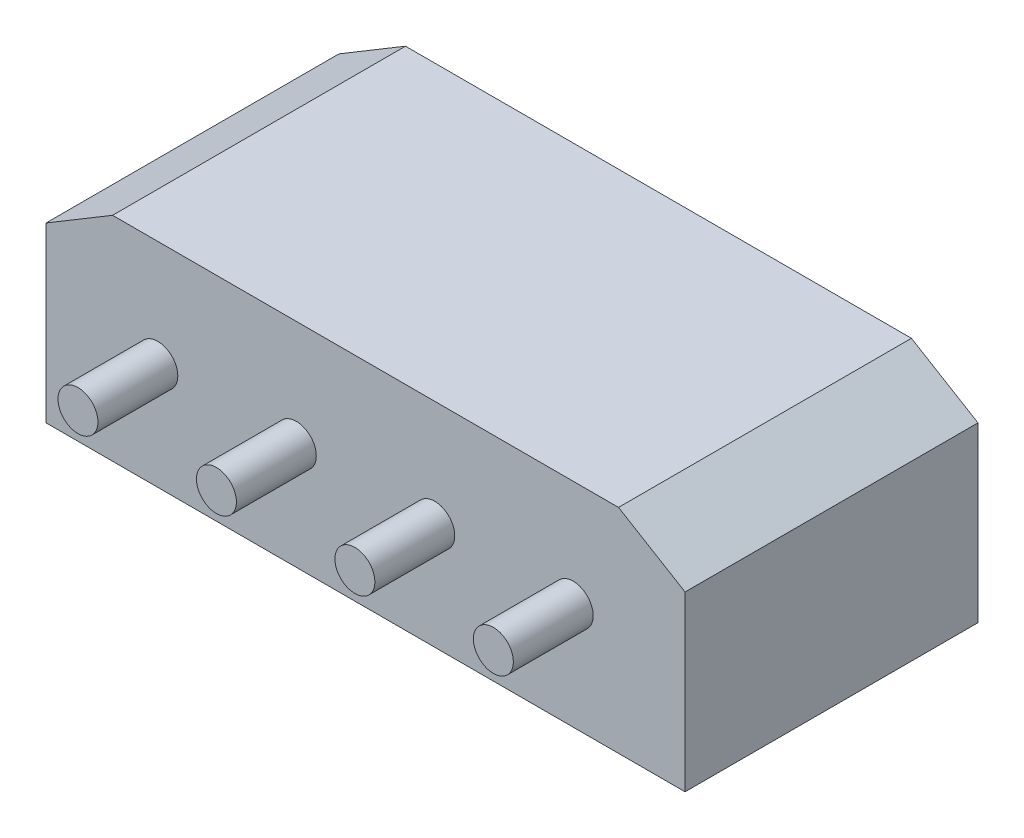
ISO-10303-21;
HEADER;
FILE_DESCRIPTION(('STEP AP214'),'2;1');
FILE_NAME('part.step','',(''),(''),'','','');
FILE_SCHEMA(('AUTOMOTIVE_DESIGN { 1 0 10303 214 1 1 1 1 }'));
ENDSEC;
DATA;
#1=APPLICATION_CONTEXT('core data for automotive mechanical design processes');
#2=APPLICATION_PROTOCOL_DEFINITION('international standard','automotive_design',2000,#1);
#3=PRODUCT_CONTEXT('',#1,'mechanical');
#4=PRODUCT('Part','Part','',(#3));
#5=PRODUCT_RELATED_PRODUCT_CATEGORY('part','',(#4));
#6=PRODUCT_DEFINITION_FORMATION('','',#4);
#7=PRODUCT_DEFINITION_CONTEXT('part definition',#1,'design');
#8=PRODUCT_DEFINITION('design','',#6,#7);
#9=PRODUCT_DEFINITION_SHAPE('','',#8);
#10=(LENGTH_UNIT() NAMED_UNIT(*) SI_UNIT(.MILLI.,.METRE.));
#11=(NAMED_UNIT(*) PLANE_ANGLE_UNIT() SI_UNIT($,.RADIAN.));
#12=(NAMED_UNIT(*) SI_UNIT($,.STERADIAN.) SOLID_ANGLE_UNIT());
#13=UNCERTAINTY_MEASURE_WITH_UNIT(LENGTH_MEASURE(1.E-05),#10,'distance_accuracy_value','');
#14=(GEOMETRIC_REPRESENTATION_CONTEXT(3) GLOBAL_UNCERTAINTY_ASSIGNED_CONTEXT((#13)) GLOBAL_UNIT_ASSIGNED_CONTEXT((#10,
#11,#12)) REPRESENTATION_CONTEXT('',''));
#15=CARTESIAN_POINT('',(0.,0.,0.));
#16=DIRECTION('',(0.,0.,1.));
#17=DIRECTION('',(1.,0.,0.));
#18=AXIS2_PLACEMENT_3D('',#15,#16,#17);
#19=CARTESIAN_POINT('',(-14.6,4.,0.));
#20=DIRECTION('',(0.,0.,1.));
#21=DIRECTION('',(1.,0.,0.));
#22=AXIS2_PLACEMENT_3D('',#19,#20,#21);
#23=CYLINDRICAL_SURFACE('',#22,0.75);
#24=CARTESIAN_POINT('',(-14.6,4.,11.));
#25=DIRECTION('',(0.,0.,1.));
#26=DIRECTION('',(1.,0.,0.));
#27=AXIS2_PLACEMENT_3D('',#24,#25,#26);
#28=CIRCLE('',#27,0.75);
#29=CARTESIAN_POINT('',(-13.85,4.,11.));
#30=VERTEX_POINT('',#29);
#31=EDGE_CURVE('E334',#30,#30,#28,.F.);
#32=ORIENTED_EDGE('',*,*,#31,.F.);
#33=EDGE_LOOP('',(#32));
#34=FACE_BOUND('',#33,.T.);
#35=CARTESIAN_POINT('',(-14.6,4.,14.));
#36=DIRECTION('',(0.,0.,1.));
#37=DIRECTION('',(1.,0.,0.));
#38=AXIS2_PLACEMENT_3D('',#35,#36,#37);
#39=CIRCLE('',#38,0.75);
#40=CARTESIAN_POINT('',(-13.85,4.,14.));
#41=VERTEX_POINT('',#40);
#42=EDGE_CURVE('E39',#41,#41,#39,.T.);
#43=ORIENTED_EDGE('',*,*,#42,.F.);
#44=EDGE_LOOP('',(#43));
#45=FACE_BOUND('',#44,.T.);
#46=ADVANCED_FACE('F35',(#34,#45),#23,.T.);
#47=CARTESIAN_POINT('',(-19.8,4.,0.));
#48=DIRECTION('',(0.,0.,1.));
#49=DIRECTION('',(1.,0.,0.));
#50=AXIS2_PLACEMENT_3D('',#47,#48,#49);
#51=CYLINDRICAL_SURFACE('',#50,0.75);
#52=CARTESIAN_POINT('',(-19.8,4.,11.));
#53=DIRECTION('',(0.,0.,1.));
#54=DIRECTION('',(1.,0.,0.));
#55=AXIS2_PLACEMENT_3D('',#52,#53,#54);
#56=CIRCLE('',#55,0.75);
#57=CARTESIAN_POINT('',(-19.05,4.,11.));
#58=VERTEX_POINT('',#57);
#59=EDGE_CURVE('E338',#58,#58,#56,.F.);
#60=ORIENTED_EDGE('',*,*,#59,.F.);
#61=EDGE_LOOP('',(#60));
#62=FACE_BOUND('',#61,.T.);
#63=CARTESIAN_POINT('',(-19.8,4.,14.));
#64=DIRECTION('',(0.,0.,1.));
#65=DIRECTION('',(1.,0.,0.));
#66=AXIS2_PLACEMENT_3D('',#63,#64,#65);
#67=CIRCLE('',#66,0.75);
#68=CARTESIAN_POINT('',(-19.05,4.,14.));
#69=VERTEX_POINT('',#68);
#70=EDGE_CURVE('E172',#69,#69,#67,.T.);
#71=ORIENTED_EDGE('',*,*,#70,.F.);
#72=EDGE_LOOP('',(#71));
#73=FACE_BOUND('',#72,.T.);
#74=ADVANCED_FACE('F182',(#62,#73),#51,.T.);
#75=CARTESIAN_POINT('',(-9.4,4.,0.));
#76=DIRECTION('',(0.,0.,1.));
#77=DIRECTION('',(1.,0.,0.));
#78=AXIS2_PLACEMENT_3D('',#75,#76,#77);
#79=CYLINDRICAL_SURFACE('',#78,0.75);
#80=CARTESIAN_POINT('',(-9.4,4.,11.));
#81=DIRECTION('',(0.,0.,1.));
#82=DIRECTION('',(1.,0.,0.));
#83=AXIS2_PLACEMENT_3D('',#80,#81,#82);
#84=CIRCLE('',#83,0.75);
#85=CARTESIAN_POINT('',(-8.65,4.,11.));
#86=VERTEX_POINT('',#85);
#87=EDGE_CURVE('E164',#86,#86,#84,.F.);
#88=ORIENTED_EDGE('',*,*,#87,.F.);
#89=EDGE_LOOP('',(#88));
#90=FACE_BOUND('',#89,.T.);
#91=CARTESIAN_POINT('',(-9.4,4.,14.));
#92=DIRECTION('',(0.,0.,1.));
#93=DIRECTION('',(1.,0.,0.));
#94=AXIS2_PLACEMENT_3D('',#91,#92,#93);
#95=CIRCLE('',#94,0.75);
#96=CARTESIAN_POINT('',(-8.65,4.,14.));
#97=VERTEX_POINT('',#96);
#98=EDGE_CURVE('E169',#97,#97,#95,.T.);
#99=ORIENTED_EDGE('',*,*,#98,.F.);
#100=EDGE_LOOP('',(#99));
#101=FACE_BOUND('',#100,.T.);
#102=ADVANCED_FACE('F190',(#90,#101),#79,.T.);
#103=CARTESIAN_POINT('',(-4.2,4.,0.));
#104=DIRECTION('',(0.,0.,1.));
#105=DIRECTION('',(1.,0.,0.));
#106=AXIS2_PLACEMENT_3D('',#103,#104,#105);
#107=CYLINDRICAL_SURFACE('',#106,0.75);
#108=CARTESIAN_POINT('',(-4.2,4.,11.));
#109=DIRECTION('',(0.,0.,1.));
#110=DIRECTION('',(1.,0.,0.));
#111=AXIS2_PLACEMENT_3D('',#108,#109,#110);
#112=CIRCLE('',#111,0.75);
#113=CARTESIAN_POINT('',(-3.45,4.,11.));
#114=VERTEX_POINT('',#113);
#115=EDGE_CURVE('E248',#114,#114,#112,.F.);
#116=ORIENTED_EDGE('',*,*,#115,.F.);
#117=EDGE_LOOP('',(#116));
#118=FACE_BOUND('',#117,.T.);
#119=CARTESIAN_POINT('',(-4.2,4.,14.));
#120=DIRECTION('',(0.,0.,1.));
#121=DIRECTION('',(1.,0.,0.));
#122=AXIS2_PLACEMENT_3D('',#119,#120,#121);
#123=CIRCLE('',#122,0.75);
#124=CARTESIAN_POINT('',(-3.45,4.,14.));
#125=VERTEX_POINT('',#124);
#126=EDGE_CURVE('E160',#125,#125,#123,.T.);
#127=ORIENTED_EDGE('',*,*,#126,.F.);
#128=EDGE_LOOP('',(#127));
#129=FACE_BOUND('',#128,.T.);
#130=ADVANCED_FACE('F298',(#118,#129),#107,.T.);
#131=CARTESIAN_POINT('',(0.,0.,11.));
#132=DIRECTION('',(-1.,0.,0.));
#133=DIRECTION('',(0.,0.,1.));
#134=AXIS2_PLACEMENT_3D('',#131,#132,#133);
#135=PLANE('',#134);
#136=DIRECTION('',(0.,1.,0.));
#137=VECTOR('',#136,1.);
#138=CARTESIAN_POINT('',(0.,0.,0.));
#139=LINE('',#138,#137);
#140=CARTESIAN_POINT('',(0.,0.,0.));
#141=VERTEX_POINT('',#140);
#142=CARTESIAN_POINT('',(0.,6.5,0.));
#143=VERTEX_POINT('',#142);
#144=EDGE_CURVE('E135',#141,#143,#139,.T.);
#145=ORIENTED_EDGE('',*,*,#144,.T.);
#146=DIRECTION('',(0.,0.,-1.));
#147=VECTOR('',#146,1.);
#148=CARTESIAN_POINT('',(0.,6.5,11.));
#149=LINE('',#148,#147);
#150=CARTESIAN_POINT('',(0.,6.5,11.));
#151=VERTEX_POINT('',#150);
#152=EDGE_CURVE('E154',#151,#143,#149,.T.);
#153=ORIENTED_EDGE('',*,*,#152,.F.);
#154=DIRECTION('',(0.,1.,0.));
#155=VECTOR('',#154,1.);
#156=CARTESIAN_POINT('',(0.,0.,11.));
#157=LINE('',#156,#155);
#158=CARTESIAN_POINT('',(0.,0.,11.));
#159=VERTEX_POINT('',#158);
#160=EDGE_CURVE('E147',#159,#151,#157,.T.);
#161=ORIENTED_EDGE('',*,*,#160,.F.);
#162=DIRECTION('',(0.,0.,-1.));
#163=VECTOR('',#162,1.);
#164=CARTESIAN_POINT('',(0.,0.,11.));
#165=LINE('',#164,#163);
#166=EDGE_CURVE('E131',#159,#141,#165,.T.);
#167=ORIENTED_EDGE('',*,*,#166,.T.);
#168=EDGE_LOOP('',(#145,#153,#161,#167));
#169=FACE_BOUND('',#168,.T.);
#170=ADVANCED_FACE('F37',(#169),#135,.F.);
#171=CARTESIAN_POINT('',(-2.5,8.,11.));
#172=DIRECTION('',(-0.514495755427526,-0.857492925712544,0.));
#173=DIRECTION('',(0.857492925712544,-0.514495755427526,0.));
#174=AXIS2_PLACEMENT_3D('',#171,#172,#173);
#175=PLANE('',#174);
#176=DIRECTION('',(-0.857492925712544,0.514495755427526,0.));
#177=VECTOR('',#176,1.);
#178=CARTESIAN_POINT('',(-2.5,8.,0.));
#179=LINE('',#178,#177);
#180=CARTESIAN_POINT('',(-2.5,8.,0.));
#181=VERTEX_POINT('',#180);
#182=EDGE_CURVE('E138',#143,#181,#179,.T.);
#183=ORIENTED_EDGE('',*,*,#182,.T.);
#184=DIRECTION('',(0.,0.,-1.));
#185=VECTOR('',#184,1.);
#186=CARTESIAN_POINT('',(-2.5,8.,11.));
#187=LINE('',#186,#185);
#188=CARTESIAN_POINT('',(-2.5,8.,11.));
#189=VERTEX_POINT('',#188);
#190=EDGE_CURVE('E151',#189,#181,#187,.T.);
#191=ORIENTED_EDGE('',*,*,#190,.F.);
#192=DIRECTION('',(-0.857492925712544,0.514495755427526,0.));
#193=VECTOR('',#192,1.);
#194=CARTESIAN_POINT('',(-2.5,8.,11.));
#195=LINE('',#194,#193);
#196=EDGE_CURVE('E97',#151,#189,#195,.T.);
#197=ORIENTED_EDGE('',*,*,#196,.F.);
#198=ORIENTED_EDGE('',*,*,#152,.T.);
#199=EDGE_LOOP('',(#183,#191,#197,#198));
#200=FACE_BOUND('',#199,.T.);
#201=ADVANCED_FACE('F288',(#200),#175,.F.);
#202=CARTESIAN_POINT('',(-2.5,8.,11.));
#203=DIRECTION('',(0.,-1.,0.));
#204=DIRECTION('',(0.,0.,-1.));
#205=AXIS2_PLACEMENT_3D('',#202,#203,#204);
#206=PLANE('',#205);
#207=DIRECTION('',(-1.,0.,0.));
#208=VECTOR('',#207,1.);
#209=CARTESIAN_POINT('',(-2.5,8.,0.));
#210=LINE('',#209,#208);
#211=CARTESIAN_POINT('',(-21.5,8.,0.));
#212=VERTEX_POINT('',#211);
#213=EDGE_CURVE('E141',#181,#212,#210,.T.);
#214=ORIENTED_EDGE('',*,*,#213,.T.);
#215=DIRECTION('',(0.,0.,-1.));
#216=VECTOR('',#215,1.);
#217=CARTESIAN_POINT('',(-21.5,8.,11.));
#218=LINE('',#217,#216);
#219=CARTESIAN_POINT('',(-21.5,8.,11.));
#220=VERTEX_POINT('',#219);
#221=EDGE_CURVE('E126',#220,#212,#218,.T.);
#222=ORIENTED_EDGE('',*,*,#221,.F.);
#223=DIRECTION('',(-1.,0.,0.));
#224=VECTOR('',#223,1.);
#225=CARTESIAN_POINT('',(-2.5,8.,11.));
#226=LINE('',#225,#224);
#227=EDGE_CURVE('E114',#189,#220,#226,.T.);
#228=ORIENTED_EDGE('',*,*,#227,.F.);
#229=ORIENTED_EDGE('',*,*,#190,.T.);
#230=EDGE_LOOP('',(#214,#222,#228,#229));
#231=FACE_BOUND('',#230,.T.);
#232=ADVANCED_FACE('F291',(#231),#206,.F.);
#233=CARTESIAN_POINT('',(-21.5,8.,11.));
#234=DIRECTION('',(0.514495755427526,-0.857492925712545,0.));
#235=DIRECTION('',(0.857492925712545,0.514495755427526,0.));
#236=AXIS2_PLACEMENT_3D('',#233,#234,#235);
#237=PLANE('',#236);
#238=DIRECTION('',(-0.857492925712544,-0.514495755427526,0.));
#239=VECTOR('',#238,1.);
#240=CARTESIAN_POINT('',(-21.5,8.,0.));
#241=LINE('',#240,#239);
#242=CARTESIAN_POINT('',(-24.,6.5,0.));
#243=VERTEX_POINT('',#242);
#244=EDGE_CURVE('E123',#212,#243,#241,.T.);
#245=ORIENTED_EDGE('',*,*,#244,.T.);
#246=DIRECTION('',(0.,0.,-1.));
#247=VECTOR('',#246,1.);
#248=CARTESIAN_POINT('',(-24.,6.5,11.));
#249=LINE('',#248,#247);
#250=CARTESIAN_POINT('',(-24.,6.5,11.));
#251=VERTEX_POINT('',#250);
#252=EDGE_CURVE('E120',#251,#243,#249,.T.);
#253=ORIENTED_EDGE('',*,*,#252,.F.);
#254=DIRECTION('',(-0.857492925712544,-0.514495755427526,0.));
#255=VECTOR('',#254,1.);
#256=CARTESIAN_POINT('',(-21.5,8.,11.));
#257=LINE('',#256,#255);
#258=EDGE_CURVE('E107',#220,#251,#257,.T.);
#259=ORIENTED_EDGE('',*,*,#258,.F.);
#260=ORIENTED_EDGE('',*,*,#221,.T.);
#261=EDGE_LOOP('',(#245,#253,#259,#260));
#262=FACE_BOUND('',#261,.T.);
#263=ADVANCED_FACE('F121',(#262),#237,.F.);
#264=CARTESIAN_POINT('',(-24.,0.,11.));
#265=DIRECTION('',(1.,0.,0.));
#266=DIRECTION('',(0.,0.,-1.));
#267=AXIS2_PLACEMENT_3D('',#264,#265,#266);
#268=PLANE('',#267);
#269=DIRECTION('',(0.,-1.,0.));
#270=VECTOR('',#269,1.);
#271=CARTESIAN_POINT('',(-24.,0.,0.));
#272=LINE('',#271,#270);
#273=CARTESIAN_POINT('',(-24.,0.,0.));
#274=VERTEX_POINT('',#273);
#275=EDGE_CURVE('E144',#243,#274,#272,.T.);
#276=ORIENTED_EDGE('',*,*,#275,.T.);
#277=DIRECTION('',(0.,0.,-1.));
#278=VECTOR('',#277,1.);
#279=CARTESIAN_POINT('',(-24.,0.,11.));
#280=LINE('',#279,#278);
#281=CARTESIAN_POINT('',(-24.,0.,11.));
#282=VERTEX_POINT('',#281);
#283=EDGE_CURVE('E127',#282,#274,#280,.T.);
#284=ORIENTED_EDGE('',*,*,#283,.F.);
#285=DIRECTION('',(0.,-1.,0.));
#286=VECTOR('',#285,1.);
#287=CARTESIAN_POINT('',(-24.,0.,11.));
#288=LINE('',#287,#286);
#289=EDGE_CURVE('E111',#251,#282,#288,.T.);
#290=ORIENTED_EDGE('',*,*,#289,.F.);
#291=ORIENTED_EDGE('',*,*,#252,.T.);
#292=EDGE_LOOP('',(#276,#284,#290,#291));
#293=FACE_BOUND('',#292,.T.);
#294=ADVANCED_FACE('F129',(#293),#268,.F.);
#295=CARTESIAN_POINT('',(0.,0.,11.));
#296=DIRECTION('',(0.,1.,0.));
#297=DIRECTION('',(0.,0.,1.));
#298=AXIS2_PLACEMENT_3D('',#295,#296,#297);
#299=PLANE('',#298);
#300=DIRECTION('',(1.,0.,0.));
#301=VECTOR('',#300,1.);
#302=CARTESIAN_POINT('',(0.,0.,0.));
#303=LINE('',#302,#301);
#304=EDGE_CURVE('E88',#274,#141,#303,.T.);
#305=ORIENTED_EDGE('',*,*,#304,.T.);
#306=ORIENTED_EDGE('',*,*,#166,.F.);
#307=DIRECTION('',(1.,0.,0.));
#308=VECTOR('',#307,1.);
#309=CARTESIAN_POINT('',(0.,0.,11.));
#310=LINE('',#309,#308);
#311=EDGE_CURVE('E61',#282,#159,#310,.T.);
#312=ORIENTED_EDGE('',*,*,#311,.F.);
#313=ORIENTED_EDGE('',*,*,#283,.T.);
#314=EDGE_LOOP('',(#305,#306,#312,#313));
#315=FACE_BOUND('',#314,.T.);
#316=ADVANCED_FACE('F295',(#315),#299,.F.);
#317=CARTESIAN_POINT('',(0.,0.,11.));
#318=DIRECTION('',(0.,0.,1.));
#319=DIRECTION('',(1.,0.,0.));
#320=AXIS2_PLACEMENT_3D('',#317,#318,#319);
#321=PLANE('',#320);
#322=ORIENTED_EDGE('',*,*,#59,.T.);
#323=EDGE_LOOP('',(#322));
#324=FACE_BOUND('',#323,.T.);
#325=ORIENTED_EDGE('',*,*,#31,.T.);
#326=EDGE_LOOP('',(#325));
#327=FACE_BOUND('',#326,.T.);
#328=ORIENTED_EDGE('',*,*,#87,.T.);
#329=EDGE_LOOP('',(#328));
#330=FACE_BOUND('',#329,.T.);
#331=ORIENTED_EDGE('',*,*,#115,.T.);
#332=EDGE_LOOP('',(#331));
#333=FACE_BOUND('',#332,.T.);
#334=ORIENTED_EDGE('',*,*,#160,.T.);
#335=ORIENTED_EDGE('',*,*,#196,.T.);
#336=ORIENTED_EDGE('',*,*,#227,.T.);
#337=ORIENTED_EDGE('',*,*,#258,.T.);
#338=ORIENTED_EDGE('',*,*,#289,.T.);
#339=ORIENTED_EDGE('',*,*,#311,.T.);
#340=EDGE_LOOP('',(#334,#335,#336,#337,#338,#339));
#341=FACE_BOUND('',#340,.T.);
#342=ADVANCED_FACE('F109',(#324,#327,#330,#333,#341),#321,.T.);
#343=CARTESIAN_POINT('',(0.,0.,0.));
#344=DIRECTION('',(0.,0.,1.));
#345=DIRECTION('',(1.,0.,0.));
#346=AXIS2_PLACEMENT_3D('',#343,#344,#345);
#347=PLANE('',#346);
#348=DIRECTION('',(0.,-1.,0.));
#349=VECTOR('',#348,1.);
#350=CARTESIAN_POINT('',(-1.,5.93380962103094,0.));
#351=LINE('',#350,#349);
#352=CARTESIAN_POINT('',(-1.,5.93380962103094,0.));
#353=VERTEX_POINT('',#352);
#354=CARTESIAN_POINT('',(-1.,1.,0.));
#355=VERTEX_POINT('',#354);
#356=EDGE_CURVE('E260',#353,#355,#351,.T.);
#357=ORIENTED_EDGE('',*,*,#356,.F.);
#358=DIRECTION('',(0.857492925712544,-0.514495755427526,0.));
#359=VECTOR('',#358,1.);
#360=CARTESIAN_POINT('',(-2.77698396494843,7.,0.));
#361=LINE('',#360,#359);
#362=CARTESIAN_POINT('',(-2.77698396494843,7.,0.));
#363=VERTEX_POINT('',#362);
#364=EDGE_CURVE('E52',#363,#353,#361,.T.);
#365=ORIENTED_EDGE('',*,*,#364,.F.);
#366=DIRECTION('',(1.,0.,0.));
#367=VECTOR('',#366,1.);
#368=CARTESIAN_POINT('',(-21.2230160350516,7.,0.));
#369=LINE('',#368,#367);
#370=CARTESIAN_POINT('',(-21.2230160350516,7.,0.));
#371=VERTEX_POINT('',#370);
#372=EDGE_CURVE('E240',#371,#363,#369,.T.);
#373=ORIENTED_EDGE('',*,*,#372,.F.);
#374=DIRECTION('',(0.857492925712544,0.514495755427527,0.));
#375=VECTOR('',#374,1.);
#376=CARTESIAN_POINT('',(-23.,5.93380962103094,0.));
#377=LINE('',#376,#375);
#378=CARTESIAN_POINT('',(-23.,5.93380962103094,0.));
#379=VERTEX_POINT('',#378);
#380=EDGE_CURVE('E245',#379,#371,#377,.T.);
#381=ORIENTED_EDGE('',*,*,#380,.F.);
#382=DIRECTION('',(0.,1.,0.));
#383=VECTOR('',#382,1.);
#384=CARTESIAN_POINT('',(-23.,1.,0.));
#385=LINE('',#384,#383);
#386=CARTESIAN_POINT('',(-23.,1.,0.));
#387=VERTEX_POINT('',#386);
#388=EDGE_CURVE('E266',#387,#379,#385,.T.);
#389=ORIENTED_EDGE('',*,*,#388,.F.);
#390=DIRECTION('',(-1.,0.,0.));
#391=VECTOR('',#390,1.);
#392=CARTESIAN_POINT('',(-1.,1.,0.));
#393=LINE('',#392,#391);
#394=EDGE_CURVE('E263',#355,#387,#393,.T.);
#395=ORIENTED_EDGE('',*,*,#394,.F.);
#396=EDGE_LOOP('',(#357,#365,#373,#381,#389,#395));
#397=FACE_BOUND('',#396,.T.);
#398=ORIENTED_EDGE('',*,*,#144,.F.);
#399=ORIENTED_EDGE('',*,*,#304,.F.);
#400=ORIENTED_EDGE('',*,*,#275,.F.);
#401=ORIENTED_EDGE('',*,*,#244,.F.);
#402=ORIENTED_EDGE('',*,*,#213,.F.);
#403=ORIENTED_EDGE('',*,*,#182,.F.);
#404=EDGE_LOOP('',(#398,#399,#400,#401,#402,#403));
#405=FACE_BOUND('',#404,.T.);
#406=ADVANCED_FACE('F294',(#397,#405),#347,.F.);
#407=CARTESIAN_POINT('',(-2.77698396494843,7.,9.));
#408=DIRECTION('',(0.514495755427526,0.857492925712544,0.));
#409=DIRECTION('',(-0.857492925712544,0.514495755427526,0.));
#410=AXIS2_PLACEMENT_3D('',#407,#408,#409);
#411=PLANE('',#410);
#412=ORIENTED_EDGE('',*,*,#364,.T.);
#413=DIRECTION('',(0.,0.,-1.));
#414=VECTOR('',#413,1.);
#415=CARTESIAN_POINT('',(-1.,5.93380962103094,9.));
#416=LINE('',#415,#414);
#417=CARTESIAN_POINT('',(-1.,5.93380962103094,9.));
#418=VERTEX_POINT('',#417);
#419=EDGE_CURVE('E258',#418,#353,#416,.T.);
#420=ORIENTED_EDGE('',*,*,#419,.F.);
#421=DIRECTION('',(0.857492925712544,-0.514495755427526,0.));
#422=VECTOR('',#421,1.);
#423=CARTESIAN_POINT('',(-2.77698396494843,7.,9.));
#424=LINE('',#423,#422);
#425=CARTESIAN_POINT('',(-2.77698396494843,7.,9.));
#426=VERTEX_POINT('',#425);
#427=EDGE_CURVE('E231',#426,#418,#424,.T.);
#428=ORIENTED_EDGE('',*,*,#427,.F.);
#429=DIRECTION('',(0.,0.,-1.));
#430=VECTOR('',#429,1.);
#431=CARTESIAN_POINT('',(-2.77698396494843,7.,9.));
#432=LINE('',#431,#430);
#433=EDGE_CURVE('E139',#426,#363,#432,.T.);
#434=ORIENTED_EDGE('',*,*,#433,.T.);
#435=EDGE_LOOP('',(#412,#420,#428,#434));
#436=FACE_BOUND('',#435,.T.);
#437=ADVANCED_FACE('F502',(#436),#411,.F.);
#438=CARTESIAN_POINT('',(-21.2230160350516,7.,9.));
#439=DIRECTION('',(0.,1.,0.));
#440=DIRECTION('',(0.,0.,1.));
#441=AXIS2_PLACEMENT_3D('',#438,#439,#440);
#442=PLANE('',#441);
#443=ORIENTED_EDGE('',*,*,#372,.T.);
#444=ORIENTED_EDGE('',*,*,#433,.F.);
#445=DIRECTION('',(1.,0.,0.));
#446=VECTOR('',#445,1.);
#447=CARTESIAN_POINT('',(-21.2230160350516,7.,9.));
#448=LINE('',#447,#446);
#449=CARTESIAN_POINT('',(-21.2230160350516,7.,9.));
#450=VERTEX_POINT('',#449);
#451=EDGE_CURVE('E238',#450,#426,#448,.T.);
#452=ORIENTED_EDGE('',*,*,#451,.F.);
#453=DIRECTION('',(0.,0.,-1.));
#454=VECTOR('',#453,1.);
#455=CARTESIAN_POINT('',(-21.2230160350516,7.,9.));
#456=LINE('',#455,#454);
#457=EDGE_CURVE('E272',#450,#371,#456,.T.);
#458=ORIENTED_EDGE('',*,*,#457,.T.);
#459=EDGE_LOOP('',(#443,#444,#452,#458));
#460=FACE_BOUND('',#459,.T.);
#461=ADVANCED_FACE('F492',(#460),#442,.F.);
#462=CARTESIAN_POINT('',(-23.,5.93380962103094,9.));
#463=DIRECTION('',(-0.514495755427527,0.857492925712544,0.));
#464=DIRECTION('',(-0.857492925712544,-0.514495755427527,0.));
#465=AXIS2_PLACEMENT_3D('',#462,#463,#464);
#466=PLANE('',#465);
#467=ORIENTED_EDGE('',*,*,#380,.T.);
#468=ORIENTED_EDGE('',*,*,#457,.F.);
#469=DIRECTION('',(0.857492925712544,0.514495755427527,0.));
#470=VECTOR('',#469,1.);
#471=CARTESIAN_POINT('',(-23.,5.93380962103094,9.));
#472=LINE('',#471,#470);
#473=CARTESIAN_POINT('',(-23.,5.93380962103094,9.));
#474=VERTEX_POINT('',#473);
#475=EDGE_CURVE('E255',#474,#450,#472,.T.);
#476=ORIENTED_EDGE('',*,*,#475,.F.);
#477=DIRECTION('',(0.,0.,-1.));
#478=VECTOR('',#477,1.);
#479=CARTESIAN_POINT('',(-23.,5.93380962103094,9.));
#480=LINE('',#479,#478);
#481=EDGE_CURVE('E275',#474,#379,#480,.T.);
#482=ORIENTED_EDGE('',*,*,#481,.T.);
#483=EDGE_LOOP('',(#467,#468,#476,#482));
#484=FACE_BOUND('',#483,.T.);
#485=ADVANCED_FACE('F482',(#484),#466,.F.);
#486=CARTESIAN_POINT('',(-23.,1.,9.));
#487=DIRECTION('',(-1.,0.,0.));
#488=DIRECTION('',(0.,0.,1.));
#489=AXIS2_PLACEMENT_3D('',#486,#487,#488);
#490=PLANE('',#489);
#491=ORIENTED_EDGE('',*,*,#388,.T.);
#492=ORIENTED_EDGE('',*,*,#481,.F.);
#493=DIRECTION('',(0.,1.,0.));
#494=VECTOR('',#493,1.);
#495=CARTESIAN_POINT('',(-23.,1.,9.));
#496=LINE('',#495,#494);
#497=CARTESIAN_POINT('',(-23.,1.,9.));
#498=VERTEX_POINT('',#497);
#499=EDGE_CURVE('E252',#498,#474,#496,.T.);
#500=ORIENTED_EDGE('',*,*,#499,.F.);
#501=DIRECTION('',(0.,0.,-1.));
#502=VECTOR('',#501,1.);
#503=CARTESIAN_POINT('',(-23.,1.,9.));
#504=LINE('',#503,#502);
#505=EDGE_CURVE('E278',#498,#387,#504,.T.);
#506=ORIENTED_EDGE('',*,*,#505,.T.);
#507=EDGE_LOOP('',(#491,#492,#500,#506));
#508=FACE_BOUND('',#507,.T.);
#509=ADVANCED_FACE('F472',(#508),#490,.F.);
#510=CARTESIAN_POINT('',(-1.,1.,9.));
#511=DIRECTION('',(0.,-1.,0.));
#512=DIRECTION('',(0.,0.,-1.));
#513=AXIS2_PLACEMENT_3D('',#510,#511,#512);
#514=PLANE('',#513);
#515=ORIENTED_EDGE('',*,*,#394,.T.);
#516=ORIENTED_EDGE('',*,*,#505,.F.);
#517=DIRECTION('',(-1.,0.,0.));
#518=VECTOR('',#517,1.);
#519=CARTESIAN_POINT('',(-1.,1.,9.));
#520=LINE('',#519,#518);
#521=CARTESIAN_POINT('',(-1.,1.,9.));
#522=VERTEX_POINT('',#521);
#523=EDGE_CURVE('E242',#522,#498,#520,.T.);
#524=ORIENTED_EDGE('',*,*,#523,.F.);
#525=DIRECTION('',(0.,0.,-1.));
#526=VECTOR('',#525,1.);
#527=CARTESIAN_POINT('',(-1.,1.,9.));
#528=LINE('',#527,#526);
#529=EDGE_CURVE('E281',#522,#355,#528,.T.);
#530=ORIENTED_EDGE('',*,*,#529,.T.);
#531=EDGE_LOOP('',(#515,#516,#524,#530));
#532=FACE_BOUND('',#531,.T.);
#533=ADVANCED_FACE('F462',(#532),#514,.F.);
#534=CARTESIAN_POINT('',(-1.,5.93380962103094,9.));
#535=DIRECTION('',(1.,0.,0.));
#536=DIRECTION('',(0.,0.,-1.));
#537=AXIS2_PLACEMENT_3D('',#534,#535,#536);
#538=PLANE('',#537);
#539=ORIENTED_EDGE('',*,*,#356,.T.);
#540=ORIENTED_EDGE('',*,*,#529,.F.);
#541=DIRECTION('',(0.,-1.,0.));
#542=VECTOR('',#541,1.);
#543=CARTESIAN_POINT('',(-1.,5.93380962103094,9.));
#544=LINE('',#543,#542);
#545=EDGE_CURVE('E235',#418,#522,#544,.T.);
#546=ORIENTED_EDGE('',*,*,#545,.F.);
#547=ORIENTED_EDGE('',*,*,#419,.T.);
#548=EDGE_LOOP('',(#539,#540,#546,#547));
#549=FACE_BOUND('',#548,.T.);
#550=ADVANCED_FACE('F219',(#549),#538,.F.);
#551=CARTESIAN_POINT('',(0.,0.,9.));
#552=DIRECTION('',(0.,0.,1.));
#553=DIRECTION('',(1.,0.,0.));
#554=AXIS2_PLACEMENT_3D('',#551,#552,#553);
#555=PLANE('',#554);
#556=CARTESIAN_POINT('',(-19.8,4.,9.));
#557=DIRECTION('',(0.,0.,1.));
#558=DIRECTION('',(1.,0.,0.));
#559=AXIS2_PLACEMENT_3D('',#556,#557,#558);
#560=CIRCLE('',#559,0.75);
#561=CARTESIAN_POINT('',(-19.05,4.,9.));
#562=VERTEX_POINT('',#561);
#563=EDGE_CURVE('E11',#562,#562,#560,.F.);
#564=ORIENTED_EDGE('',*,*,#563,.F.);
#565=EDGE_LOOP('',(#564));
#566=FACE_BOUND('',#565,.T.);
#567=CARTESIAN_POINT('',(-14.6,4.,9.));
#568=DIRECTION('',(0.,0.,1.));
#569=DIRECTION('',(1.,0.,0.));
#570=AXIS2_PLACEMENT_3D('',#567,#568,#569);
#571=CIRCLE('',#570,0.75);
#572=CARTESIAN_POINT('',(-13.85,4.,9.));
#573=VERTEX_POINT('',#572);
#574=EDGE_CURVE('E44',#573,#573,#571,.F.);
#575=ORIENTED_EDGE('',*,*,#574,.F.);
#576=EDGE_LOOP('',(#575));
#577=FACE_BOUND('',#576,.T.);
#578=CARTESIAN_POINT('',(-9.4,4.,9.));
#579=DIRECTION('',(0.,0.,1.));
#580=DIRECTION('',(1.,0.,0.));
#581=AXIS2_PLACEMENT_3D('',#578,#579,#580);
#582=CIRCLE('',#581,0.75);
#583=CARTESIAN_POINT('',(-8.65,4.,9.));
#584=VERTEX_POINT('',#583);
#585=EDGE_CURVE('E159',#584,#584,#582,.F.);
#586=ORIENTED_EDGE('',*,*,#585,.F.);
#587=EDGE_LOOP('',(#586));
#588=FACE_BOUND('',#587,.T.);
#589=CARTESIAN_POINT('',(-4.2,4.,9.));
#590=DIRECTION('',(0.,0.,1.));
#591=DIRECTION('',(1.,0.,0.));
#592=AXIS2_PLACEMENT_3D('',#589,#590,#591);
#593=CIRCLE('',#592,0.75);
#594=CARTESIAN_POINT('',(-3.45,4.,9.));
#595=VERTEX_POINT('',#594);
#596=EDGE_CURVE('E156',#595,#595,#593,.F.);
#597=ORIENTED_EDGE('',*,*,#596,.F.);
#598=EDGE_LOOP('',(#597));
#599=FACE_BOUND('',#598,.T.);
#600=ORIENTED_EDGE('',*,*,#427,.T.);
#601=ORIENTED_EDGE('',*,*,#545,.T.);
#602=ORIENTED_EDGE('',*,*,#523,.T.);
#603=ORIENTED_EDGE('',*,*,#499,.T.);
#604=ORIENTED_EDGE('',*,*,#475,.T.);
#605=ORIENTED_EDGE('',*,*,#451,.T.);
#606=EDGE_LOOP('',(#600,#601,#602,#603,#604,#605));
#607=FACE_BOUND('',#606,.T.);
#608=ADVANCED_FACE('F215',(#566,#577,#588,#599,#607),#555,.F.);
#609=CARTESIAN_POINT('',(-4.2,4.,0.));
#610=DIRECTION('',(0.,0.,-1.));
#611=DIRECTION('',(-1.,0.,0.));
#612=AXIS2_PLACEMENT_3D('',#609,#610,#611);
#613=PLANE('',#612);
#614=CARTESIAN_POINT('',(-4.2,4.,0.));
#615=DIRECTION('',(0.,0.,-1.));
#616=DIRECTION('',(-1.,0.,0.));
#617=AXIS2_PLACEMENT_3D('',#614,#615,#616);
#618=CIRCLE('',#617,0.75);
#619=CARTESIAN_POINT('',(-4.95,4.,0.));
#620=VERTEX_POINT('',#619);
#621=EDGE_CURVE('E163',#620,#620,#618,.T.);
#622=ORIENTED_EDGE('',*,*,#621,.T.);
#623=EDGE_LOOP('',(#622));
#624=FACE_BOUND('',#623,.T.);
#625=ADVANCED_FACE('F218',(#624),#613,.T.);
#626=ORIENTED_EDGE('',*,*,#621,.F.);
#627=EDGE_LOOP('',(#626));
#628=FACE_BOUND('',#627,.T.);
#629=ORIENTED_EDGE('',*,*,#596,.T.);
#630=EDGE_LOOP('',(#629));
#631=FACE_BOUND('',#630,.T.);
#632=ADVANCED_FACE('F305',(#628,#631),#107,.T.);
#633=CARTESIAN_POINT('',(-4.2,4.,14.));
#634=DIRECTION('',(0.,0.,1.));
#635=DIRECTION('',(1.,0.,0.));
#636=AXIS2_PLACEMENT_3D('',#633,#634,#635);
#637=PLANE('',#636);
#638=ORIENTED_EDGE('',*,*,#126,.T.);
#639=EDGE_LOOP('',(#638));
#640=FACE_BOUND('',#639,.T.);
#641=ADVANCED_FACE('F315',(#640),#637,.T.);
#642=CARTESIAN_POINT('',(-9.4,4.,0.));
#643=DIRECTION('',(0.,0.,-1.));
#644=DIRECTION('',(-1.,0.,0.));
#645=AXIS2_PLACEMENT_3D('',#642,#643,#644);
#646=PLANE('',#645);
#647=CARTESIAN_POINT('',(-9.4,4.,0.));
#648=DIRECTION('',(0.,0.,-1.));
#649=DIRECTION('',(-1.,0.,0.));
#650=AXIS2_PLACEMENT_3D('',#647,#648,#649);
#651=CIRCLE('',#650,0.75);
#652=CARTESIAN_POINT('',(-10.15,4.,0.));
#653=VERTEX_POINT('',#652);
#654=EDGE_CURVE('E331',#653,#653,#651,.T.);
#655=ORIENTED_EDGE('',*,*,#654,.T.);
#656=EDGE_LOOP('',(#655));
#657=FACE_BOUND('',#656,.T.);
#658=ADVANCED_FACE('F320',(#657),#646,.T.);
#659=ORIENTED_EDGE('',*,*,#654,.F.);
#660=EDGE_LOOP('',(#659));
#661=FACE_BOUND('',#660,.T.);
#662=ORIENTED_EDGE('',*,*,#585,.T.);
#663=EDGE_LOOP('',(#662));
#664=FACE_BOUND('',#663,.T.);
#665=ADVANCED_FACE('F207',(#661,#664),#79,.T.);
#666=CARTESIAN_POINT('',(-14.6,4.,0.));
#667=DIRECTION('',(0.,0.,-1.));
#668=DIRECTION('',(-1.,0.,0.));
#669=AXIS2_PLACEMENT_3D('',#666,#667,#668);
#670=PLANE('',#669);
#671=CARTESIAN_POINT('',(-14.6,4.,0.));
#672=DIRECTION('',(0.,0.,-1.));
#673=DIRECTION('',(-1.,0.,0.));
#674=AXIS2_PLACEMENT_3D('',#671,#672,#673);
#675=CIRCLE('',#674,0.75);
#676=CARTESIAN_POINT('',(-15.35,4.,0.));
#677=VERTEX_POINT('',#676);
#678=EDGE_CURVE('E212',#677,#677,#675,.T.);
#679=ORIENTED_EDGE('',*,*,#678,.T.);
#680=EDGE_LOOP('',(#679));
#681=FACE_BOUND('',#680,.T.);
#682=ADVANCED_FACE('F199',(#681),#670,.T.);
#683=ORIENTED_EDGE('',*,*,#678,.F.);
#684=EDGE_LOOP('',(#683));
#685=FACE_BOUND('',#684,.T.);
#686=ORIENTED_EDGE('',*,*,#574,.T.);
#687=EDGE_LOOP('',(#686));
#688=FACE_BOUND('',#687,.T.);
#689=ADVANCED_FACE('F185',(#685,#688),#23,.T.);
#690=CARTESIAN_POINT('',(-19.8,4.,0.));
#691=DIRECTION('',(0.,0.,-1.));
#692=DIRECTION('',(-1.,0.,0.));
#693=AXIS2_PLACEMENT_3D('',#690,#691,#692);
#694=PLANE('',#693);
#695=CARTESIAN_POINT('',(-19.8,4.,0.));
#696=DIRECTION('',(0.,0.,-1.));
#697=DIRECTION('',(-1.,0.,0.));
#698=AXIS2_PLACEMENT_3D('',#695,#696,#697);
#699=CIRCLE('',#698,0.75);
#700=CARTESIAN_POINT('',(-20.55,4.,0.));
#701=VERTEX_POINT('',#700);
#702=EDGE_CURVE('E171',#701,#701,#699,.T.);
#703=ORIENTED_EDGE('',*,*,#702,.T.);
#704=EDGE_LOOP('',(#703));
#705=FACE_BOUND('',#704,.T.);
#706=ADVANCED_FACE('F198',(#705),#694,.T.);
#707=ORIENTED_EDGE('',*,*,#702,.F.);
#708=EDGE_LOOP('',(#707));
#709=FACE_BOUND('',#708,.T.);
#710=ORIENTED_EDGE('',*,*,#563,.T.);
#711=EDGE_LOOP('',(#710));
#712=FACE_BOUND('',#711,.T.);
#713=ADVANCED_FACE('F193',(#709,#712),#51,.T.);
#714=CARTESIAN_POINT('',(-9.4,4.,14.));
#715=DIRECTION('',(0.,0.,1.));
#716=DIRECTION('',(1.,0.,0.));
#717=AXIS2_PLACEMENT_3D('',#714,#715,#716);
#718=PLANE('',#717);
#719=ORIENTED_EDGE('',*,*,#98,.T.);
#720=EDGE_LOOP('',(#719));
#721=FACE_BOUND('',#720,.T.);
#722=ADVANCED_FACE('F346',(#721),#718,.T.);
#723=CARTESIAN_POINT('',(-19.8,4.,14.));
#724=DIRECTION('',(0.,0.,1.));
#725=DIRECTION('',(1.,0.,0.));
#726=AXIS2_PLACEMENT_3D('',#723,#724,#725);
#727=PLANE('',#726);
#728=ORIENTED_EDGE('',*,*,#70,.T.);
#729=EDGE_LOOP('',(#728));
#730=FACE_BOUND('',#729,.T.);
#731=ADVANCED_FACE('F351',(#730),#727,.T.);
#732=CARTESIAN_POINT('',(-14.6,4.,14.));
#733=DIRECTION('',(0.,0.,1.));
#734=DIRECTION('',(1.,0.,0.));
#735=AXIS2_PLACEMENT_3D('',#732,#733,#734);
#736=PLANE('',#735);
#737=ORIENTED_EDGE('',*,*,#42,.T.);
#738=EDGE_LOOP('',(#737));
#739=FACE_BOUND('',#738,.T.);
#740=ADVANCED_FACE('F179',(#739),#736,.T.);
#741=CLOSED_SHELL('',(#46,#74,#102,#130,#170,#201,#232,#263,#294,#316,#342,#406,#437,#461,#485,
#509,#533,#550,#608,#625,#632,#641,#658,#665,#682,#689,#706,#713,#722,#731,#740));
#742=MANIFOLD_SOLID_BREP('B2',#741);
#743=ADVANCED_BREP_SHAPE_REPRESENTATION('',(#18,#742),#14);
#744=SHAPE_DEFINITION_REPRESENTATION(#9,#743);
ENDSEC;
END-ISO-10303-21;
